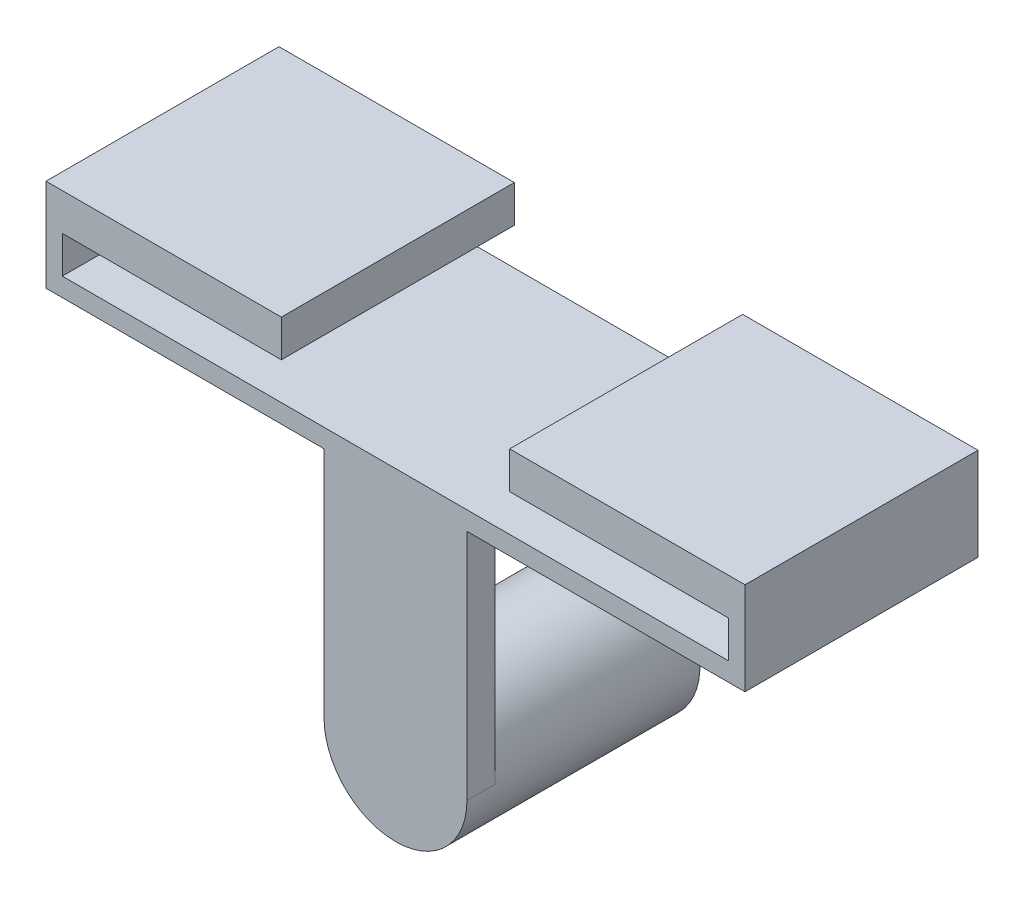
ISO-10303-21;
HEADER;
FILE_DESCRIPTION(('STEP AP214'),'2;1');
FILE_NAME('part.step','',(''),(''),'','','');
FILE_SCHEMA(('AUTOMOTIVE_DESIGN { 1 0 10303 214 1 1 1 1 }'));
ENDSEC;
DATA;
#1=APPLICATION_CONTEXT('core data for automotive mechanical design processes');
#2=APPLICATION_PROTOCOL_DEFINITION('international standard','automotive_design',2000,#1);
#3=PRODUCT_CONTEXT('',#1,'mechanical');
#4=PRODUCT('Part','Part','',(#3));
#5=PRODUCT_RELATED_PRODUCT_CATEGORY('part','',(#4));
#6=PRODUCT_DEFINITION_FORMATION('','',#4);
#7=PRODUCT_DEFINITION_CONTEXT('part definition',#1,'design');
#8=PRODUCT_DEFINITION('design','',#6,#7);
#9=PRODUCT_DEFINITION_SHAPE('','',#8);
#10=(LENGTH_UNIT() NAMED_UNIT(*) SI_UNIT(.MILLI.,.METRE.));
#11=(NAMED_UNIT(*) PLANE_ANGLE_UNIT() SI_UNIT($,.RADIAN.));
#12=(NAMED_UNIT(*) SI_UNIT($,.STERADIAN.) SOLID_ANGLE_UNIT());
#13=UNCERTAINTY_MEASURE_WITH_UNIT(LENGTH_MEASURE(1.E-05),#10,'distance_accuracy_value','');
#14=(GEOMETRIC_REPRESENTATION_CONTEXT(3) GLOBAL_UNCERTAINTY_ASSIGNED_CONTEXT((#13)) GLOBAL_UNIT_ASSIGNED_CONTEXT((#10,
#11,#12)) REPRESENTATION_CONTEXT('',''));
#15=CARTESIAN_POINT('',(0.,0.,0.));
#16=DIRECTION('',(0.,0.,1.));
#17=DIRECTION('',(1.,0.,0.));
#18=AXIS2_PLACEMENT_3D('',#15,#16,#17);
#19=CARTESIAN_POINT('',(12.4424225352113,10.1092,-25.4));
#20=DIRECTION('',(0.,-1.,0.));
#21=DIRECTION('',(1.,0.,0.));
#22=AXIS2_PLACEMENT_3D('',#19,#20,#21);
#23=PLANE('',#22);
#24=DIRECTION('',(1.,0.,0.));
#25=VECTOR('',#24,1.);
#26=CARTESIAN_POINT('',(12.4424225352113,10.1092,0.));
#27=LINE('',#26,#25);
#28=CARTESIAN_POINT('',(12.4424225352113,10.1092,0.));
#29=VERTEX_POINT('',#28);
#30=CARTESIAN_POINT('',(38.1,10.1092,0.));
#31=VERTEX_POINT('',#30);
#32=EDGE_CURVE('E177',#29,#31,#27,.T.);
#33=ORIENTED_EDGE('',*,*,#32,.T.);
#34=DIRECTION('',(0.,0.,1.));
#35=VECTOR('',#34,1.);
#36=CARTESIAN_POINT('',(38.1,10.1092,-25.4));
#37=LINE('',#36,#35);
#38=CARTESIAN_POINT('',(38.1,10.1092,-25.4));
#39=VERTEX_POINT('',#38);
#40=EDGE_CURVE('E52',#39,#31,#37,.T.);
#41=ORIENTED_EDGE('',*,*,#40,.F.);
#42=DIRECTION('',(1.,0.,0.));
#43=VECTOR('',#42,1.);
#44=CARTESIAN_POINT('',(12.4424225352113,10.1092,-25.4));
#45=LINE('',#44,#43);
#46=CARTESIAN_POINT('',(12.4424225352113,10.1092,-25.4));
#47=VERTEX_POINT('',#46);
#48=EDGE_CURVE('E119',#47,#39,#45,.T.);
#49=ORIENTED_EDGE('',*,*,#48,.F.);
#50=DIRECTION('',(0.,0.,1.));
#51=VECTOR('',#50,1.);
#52=CARTESIAN_POINT('',(12.4424225352113,10.1092,-25.4));
#53=LINE('',#52,#51);
#54=EDGE_CURVE('E68',#47,#29,#53,.T.);
#55=ORIENTED_EDGE('',*,*,#54,.T.);
#56=EDGE_LOOP('',(#33,#41,#49,#55));
#57=FACE_BOUND('',#56,.T.);
#58=ADVANCED_FACE('F45',(#57),#23,.F.);
#59=CARTESIAN_POINT('',(38.1,0.,-25.4));
#60=DIRECTION('',(1.,0.,0.));
#61=DIRECTION('',(0.,0.,-1.));
#62=AXIS2_PLACEMENT_3D('',#59,#60,#61);
#63=PLANE('',#62);
#64=DIRECTION('',(0.,1.,0.));
#65=VECTOR('',#64,1.);
#66=CARTESIAN_POINT('',(38.1,0.,0.));
#67=LINE('',#66,#65);
#68=CARTESIAN_POINT('',(38.1,0.,0.));
#69=VERTEX_POINT('',#68);
#70=EDGE_CURVE('E179',#69,#31,#67,.T.);
#71=ORIENTED_EDGE('',*,*,#70,.F.);
#72=DIRECTION('',(0.,0.,1.));
#73=VECTOR('',#72,1.);
#74=CARTESIAN_POINT('',(38.1,0.,-25.4));
#75=LINE('',#74,#73);
#76=CARTESIAN_POINT('',(38.1,0.,-25.4));
#77=VERTEX_POINT('',#76);
#78=EDGE_CURVE('E226',#77,#69,#75,.T.);
#79=ORIENTED_EDGE('',*,*,#78,.F.);
#80=DIRECTION('',(0.,1.,0.));
#81=VECTOR('',#80,1.);
#82=CARTESIAN_POINT('',(38.1,0.,-25.4));
#83=LINE('',#82,#81);
#84=EDGE_CURVE('E232',#77,#39,#83,.T.);
#85=ORIENTED_EDGE('',*,*,#84,.T.);
#86=ORIENTED_EDGE('',*,*,#40,.T.);
#87=EDGE_LOOP('',(#71,#79,#85,#86));
#88=FACE_BOUND('',#87,.T.);
#89=ADVANCED_FACE('F231',(#88),#63,.T.);
#90=CARTESIAN_POINT('',(-38.1,0.,-25.4));
#91=DIRECTION('',(0.,-1.,0.));
#92=DIRECTION('',(0.,0.,-1.));
#93=AXIS2_PLACEMENT_3D('',#90,#91,#92);
#94=PLANE('',#93);
#95=DIRECTION('',(0.,0.,1.));
#96=VECTOR('',#95,1.);
#97=CARTESIAN_POINT('',(7.79061514853763,0.,-3.048));
#98=LINE('',#97,#96);
#99=CARTESIAN_POINT('',(7.79061514853763,0.,-3.048));
#100=VERTEX_POINT('',#99);
#101=CARTESIAN_POINT('',(7.79061514853763,0.,0.));
#102=VERTEX_POINT('',#101);
#103=EDGE_CURVE('E420',#100,#102,#98,.T.);
#104=ORIENTED_EDGE('',*,*,#103,.F.);
#105=DIRECTION('',(1.,0.,0.));
#106=VECTOR('',#105,1.);
#107=CARTESIAN_POINT('',(0.,0.,-3.048));
#108=LINE('',#107,#106);
#109=CARTESIAN_POINT('',(-7.79061514853763,0.,-3.048));
#110=VERTEX_POINT('',#109);
#111=EDGE_CURVE('E414',#110,#100,#108,.T.);
#112=ORIENTED_EDGE('',*,*,#111,.F.);
#113=DIRECTION('',(0.,0.,1.));
#114=VECTOR('',#113,1.);
#115=CARTESIAN_POINT('',(-7.79061514853763,0.,-3.048));
#116=LINE('',#115,#114);
#117=CARTESIAN_POINT('',(-7.79061514853763,0.,0.));
#118=VERTEX_POINT('',#117);
#119=EDGE_CURVE('E180',#110,#118,#116,.T.);
#120=ORIENTED_EDGE('',*,*,#119,.T.);
#121=DIRECTION('',(1.,0.,0.));
#122=VECTOR('',#121,1.);
#123=CARTESIAN_POINT('',(-38.1,0.,0.));
#124=LINE('',#123,#122);
#125=CARTESIAN_POINT('',(-38.1,0.,0.));
#126=VERTEX_POINT('',#125);
#127=EDGE_CURVE('E184',#126,#118,#124,.T.);
#128=ORIENTED_EDGE('',*,*,#127,.F.);
#129=DIRECTION('',(0.,0.,1.));
#130=VECTOR('',#129,1.);
#131=CARTESIAN_POINT('',(-38.1,0.,-25.4));
#132=LINE('',#131,#130);
#133=CARTESIAN_POINT('',(-38.1,0.,-25.4));
#134=VERTEX_POINT('',#133);
#135=EDGE_CURVE('E224',#134,#126,#132,.T.);
#136=ORIENTED_EDGE('',*,*,#135,.F.);
#137=DIRECTION('',(1.,0.,0.));
#138=VECTOR('',#137,1.);
#139=CARTESIAN_POINT('',(-38.1,0.,-25.4));
#140=LINE('',#139,#138);
#141=EDGE_CURVE('E245',#134,#77,#140,.T.);
#142=ORIENTED_EDGE('',*,*,#141,.T.);
#143=ORIENTED_EDGE('',*,*,#78,.T.);
#144=EDGE_CURVE('E183',#102,#69,#124,.T.);
#145=ORIENTED_EDGE('',*,*,#144,.F.);
#146=EDGE_LOOP('',(#104,#112,#120,#128,#136,#142,#143,#145));
#147=FACE_BOUND('',#146,.T.);
#148=ADVANCED_FACE('F243',(#147),#94,.T.);
#149=CARTESIAN_POINT('',(-38.1,0.,-25.4));
#150=DIRECTION('',(1.,0.,0.));
#151=DIRECTION('',(0.,0.,-1.));
#152=AXIS2_PLACEMENT_3D('',#149,#150,#151);
#153=PLANE('',#152);
#154=DIRECTION('',(0.,1.,0.));
#155=VECTOR('',#154,1.);
#156=CARTESIAN_POINT('',(-38.1,0.,0.));
#157=LINE('',#156,#155);
#158=CARTESIAN_POINT('',(-38.1,10.1092,0.));
#159=VERTEX_POINT('',#158);
#160=EDGE_CURVE('E187',#126,#159,#157,.T.);
#161=ORIENTED_EDGE('',*,*,#160,.T.);
#162=DIRECTION('',(0.,0.,1.));
#163=VECTOR('',#162,1.);
#164=CARTESIAN_POINT('',(-38.1,10.1092,-25.4));
#165=LINE('',#164,#163);
#166=CARTESIAN_POINT('',(-38.1,10.1092,-25.4));
#167=VERTEX_POINT('',#166);
#168=EDGE_CURVE('E221',#167,#159,#165,.T.);
#169=ORIENTED_EDGE('',*,*,#168,.F.);
#170=DIRECTION('',(0.,1.,0.));
#171=VECTOR('',#170,1.);
#172=CARTESIAN_POINT('',(-38.1,0.,-25.4));
#173=LINE('',#172,#171);
#174=EDGE_CURVE('E247',#134,#167,#173,.T.);
#175=ORIENTED_EDGE('',*,*,#174,.F.);
#176=ORIENTED_EDGE('',*,*,#135,.T.);
#177=EDGE_LOOP('',(#161,#169,#175,#176));
#178=FACE_BOUND('',#177,.T.);
#179=ADVANCED_FACE('F284',(#178),#153,.F.);
#180=CARTESIAN_POINT('',(-38.1,10.1092,-25.4));
#181=DIRECTION('',(0.,-1.,0.));
#182=DIRECTION('',(0.,0.,-1.));
#183=AXIS2_PLACEMENT_3D('',#180,#181,#182);
#184=PLANE('',#183);
#185=DIRECTION('',(1.,0.,0.));
#186=VECTOR('',#185,1.);
#187=CARTESIAN_POINT('',(-38.1,10.1092,0.));
#188=LINE('',#187,#186);
#189=CARTESIAN_POINT('',(-12.4424225352113,10.1092,0.));
#190=VERTEX_POINT('',#189);
#191=EDGE_CURVE('E189',#159,#190,#188,.T.);
#192=ORIENTED_EDGE('',*,*,#191,.T.);
#193=DIRECTION('',(0.,0.,1.));
#194=VECTOR('',#193,1.);
#195=CARTESIAN_POINT('',(-12.4424225352113,10.1092,-25.4));
#196=LINE('',#195,#194);
#197=CARTESIAN_POINT('',(-12.4424225352113,10.1092,-25.4));
#198=VERTEX_POINT('',#197);
#199=EDGE_CURVE('E218',#198,#190,#196,.T.);
#200=ORIENTED_EDGE('',*,*,#199,.F.);
#201=DIRECTION('',(1.,0.,0.));
#202=VECTOR('',#201,1.);
#203=CARTESIAN_POINT('',(-38.1,10.1092,-25.4));
#204=LINE('',#203,#202);
#205=EDGE_CURVE('E253',#167,#198,#204,.T.);
#206=ORIENTED_EDGE('',*,*,#205,.F.);
#207=ORIENTED_EDGE('',*,*,#168,.T.);
#208=EDGE_LOOP('',(#192,#200,#206,#207));
#209=FACE_BOUND('',#208,.T.);
#210=ADVANCED_FACE('F288',(#209),#184,.F.);
#211=CARTESIAN_POINT('',(-12.4424225352113,10.1092,-25.4));
#212=DIRECTION('',(-1.,0.,0.));
#213=DIRECTION('',(0.,-1.,0.));
#214=AXIS2_PLACEMENT_3D('',#211,#212,#213);
#215=PLANE('',#214);
#216=DIRECTION('',(0.,-1.,0.));
#217=VECTOR('',#216,1.);
#218=CARTESIAN_POINT('',(-12.4424225352113,10.1092,0.));
#219=LINE('',#218,#217);
#220=CARTESIAN_POINT('',(-12.4424225352113,6.0706,0.));
#221=VERTEX_POINT('',#220);
#222=EDGE_CURVE('E191',#190,#221,#219,.T.);
#223=ORIENTED_EDGE('',*,*,#222,.T.);
#224=DIRECTION('',(0.,0.,1.));
#225=VECTOR('',#224,1.);
#226=CARTESIAN_POINT('',(-12.4424225352113,6.0706,-25.4));
#227=LINE('',#226,#225);
#228=CARTESIAN_POINT('',(-12.4424225352113,6.0706,-25.4));
#229=VERTEX_POINT('',#228);
#230=EDGE_CURVE('E216',#229,#221,#227,.T.);
#231=ORIENTED_EDGE('',*,*,#230,.F.);
#232=DIRECTION('',(0.,-1.,0.));
#233=VECTOR('',#232,1.);
#234=CARTESIAN_POINT('',(-12.4424225352113,10.1092,-25.4));
#235=LINE('',#234,#233);
#236=EDGE_CURVE('E255',#198,#229,#235,.T.);
#237=ORIENTED_EDGE('',*,*,#236,.F.);
#238=ORIENTED_EDGE('',*,*,#199,.T.);
#239=EDGE_LOOP('',(#223,#231,#237,#238));
#240=FACE_BOUND('',#239,.T.);
#241=ADVANCED_FACE('F292',(#240),#215,.F.);
#242=CARTESIAN_POINT('',(-36.322,6.0706,-25.4));
#243=DIRECTION('',(0.,-1.,0.));
#244=DIRECTION('',(0.,0.,-1.));
#245=AXIS2_PLACEMENT_3D('',#242,#243,#244);
#246=PLANE('',#245);
#247=DIRECTION('',(1.,0.,0.));
#248=VECTOR('',#247,1.);
#249=CARTESIAN_POINT('',(-36.322,6.0706,0.));
#250=LINE('',#249,#248);
#251=CARTESIAN_POINT('',(-36.322,6.0706,0.));
#252=VERTEX_POINT('',#251);
#253=EDGE_CURVE('E194',#252,#221,#250,.T.);
#254=ORIENTED_EDGE('',*,*,#253,.F.);
#255=DIRECTION('',(0.,0.,1.));
#256=VECTOR('',#255,1.);
#257=CARTESIAN_POINT('',(-36.322,6.0706,-25.4));
#258=LINE('',#257,#256);
#259=CARTESIAN_POINT('',(-36.322,6.0706,-25.4));
#260=VERTEX_POINT('',#259);
#261=EDGE_CURVE('E214',#260,#252,#258,.T.);
#262=ORIENTED_EDGE('',*,*,#261,.F.);
#263=DIRECTION('',(1.,0.,0.));
#264=VECTOR('',#263,1.);
#265=CARTESIAN_POINT('',(-36.322,6.0706,-25.4));
#266=LINE('',#265,#264);
#267=EDGE_CURVE('E257',#260,#229,#266,.T.);
#268=ORIENTED_EDGE('',*,*,#267,.T.);
#269=ORIENTED_EDGE('',*,*,#230,.T.);
#270=EDGE_LOOP('',(#254,#262,#268,#269));
#271=FACE_BOUND('',#270,.T.);
#272=ADVANCED_FACE('F296',(#271),#246,.T.);
#273=CARTESIAN_POINT('',(-36.322,6.0706,-25.4));
#274=DIRECTION('',(-1.,0.,0.));
#275=DIRECTION('',(0.,-1.,0.));
#276=AXIS2_PLACEMENT_3D('',#273,#274,#275);
#277=PLANE('',#276);
#278=DIRECTION('',(0.,-1.,0.));
#279=VECTOR('',#278,1.);
#280=CARTESIAN_POINT('',(-36.322,6.0706,0.));
#281=LINE('',#280,#279);
#282=CARTESIAN_POINT('',(-36.322,2.032,0.));
#283=VERTEX_POINT('',#282);
#284=EDGE_CURVE('E197',#252,#283,#281,.T.);
#285=ORIENTED_EDGE('',*,*,#284,.T.);
#286=DIRECTION('',(0.,0.,1.));
#287=VECTOR('',#286,1.);
#288=CARTESIAN_POINT('',(-36.322,2.032,-25.4));
#289=LINE('',#288,#287);
#290=CARTESIAN_POINT('',(-36.322,2.032,-25.4));
#291=VERTEX_POINT('',#290);
#292=EDGE_CURVE('E212',#291,#283,#289,.T.);
#293=ORIENTED_EDGE('',*,*,#292,.F.);
#294=DIRECTION('',(0.,-1.,0.));
#295=VECTOR('',#294,1.);
#296=CARTESIAN_POINT('',(-36.322,6.0706,-25.4));
#297=LINE('',#296,#295);
#298=EDGE_CURVE('E260',#260,#291,#297,.T.);
#299=ORIENTED_EDGE('',*,*,#298,.F.);
#300=ORIENTED_EDGE('',*,*,#261,.T.);
#301=EDGE_LOOP('',(#285,#293,#299,#300));
#302=FACE_BOUND('',#301,.T.);
#303=ADVANCED_FACE('F300',(#302),#277,.F.);
#304=CARTESIAN_POINT('',(36.322,2.032,-25.4));
#305=DIRECTION('',(0.,1.,0.));
#306=DIRECTION('',(-1.,0.,0.));
#307=AXIS2_PLACEMENT_3D('',#304,#305,#306);
#308=PLANE('',#307);
#309=DIRECTION('',(-1.,0.,0.));
#310=VECTOR('',#309,1.);
#311=CARTESIAN_POINT('',(36.322,2.032,0.));
#312=LINE('',#311,#310);
#313=CARTESIAN_POINT('',(36.322,2.032,0.));
#314=VERTEX_POINT('',#313);
#315=EDGE_CURVE('E200',#314,#283,#312,.T.);
#316=ORIENTED_EDGE('',*,*,#315,.F.);
#317=DIRECTION('',(0.,0.,1.));
#318=VECTOR('',#317,1.);
#319=CARTESIAN_POINT('',(36.322,2.032,-25.4));
#320=LINE('',#319,#318);
#321=CARTESIAN_POINT('',(36.322,2.032,-25.4));
#322=VERTEX_POINT('',#321);
#323=EDGE_CURVE('E161',#322,#314,#320,.T.);
#324=ORIENTED_EDGE('',*,*,#323,.F.);
#325=DIRECTION('',(-1.,0.,0.));
#326=VECTOR('',#325,1.);
#327=CARTESIAN_POINT('',(36.322,2.032,-25.4));
#328=LINE('',#327,#326);
#329=EDGE_CURVE('E169',#322,#291,#328,.T.);
#330=ORIENTED_EDGE('',*,*,#329,.T.);
#331=ORIENTED_EDGE('',*,*,#292,.T.);
#332=EDGE_LOOP('',(#316,#324,#330,#331));
#333=FACE_BOUND('',#332,.T.);
#334=ADVANCED_FACE('F263',(#333),#308,.T.);
#335=CARTESIAN_POINT('',(36.322,6.0706,-25.4));
#336=DIRECTION('',(-1.,0.,0.));
#337=DIRECTION('',(0.,-1.,0.));
#338=AXIS2_PLACEMENT_3D('',#335,#336,#337);
#339=PLANE('',#338);
#340=DIRECTION('',(0.,-1.,0.));
#341=VECTOR('',#340,1.);
#342=CARTESIAN_POINT('',(36.322,6.0706,0.));
#343=LINE('',#342,#341);
#344=CARTESIAN_POINT('',(36.322,6.0706,0.));
#345=VERTEX_POINT('',#344);
#346=EDGE_CURVE('E156',#345,#314,#343,.T.);
#347=ORIENTED_EDGE('',*,*,#346,.F.);
#348=DIRECTION('',(0.,0.,1.));
#349=VECTOR('',#348,1.);
#350=CARTESIAN_POINT('',(36.322,6.0706,-25.4));
#351=LINE('',#350,#349);
#352=CARTESIAN_POINT('',(36.322,6.0706,-25.4));
#353=VERTEX_POINT('',#352);
#354=EDGE_CURVE('E151',#353,#345,#351,.T.);
#355=ORIENTED_EDGE('',*,*,#354,.F.);
#356=DIRECTION('',(0.,-1.,0.));
#357=VECTOR('',#356,1.);
#358=CARTESIAN_POINT('',(36.322,6.0706,-25.4));
#359=LINE('',#358,#357);
#360=EDGE_CURVE('E154',#353,#322,#359,.T.);
#361=ORIENTED_EDGE('',*,*,#360,.T.);
#362=ORIENTED_EDGE('',*,*,#323,.T.);
#363=EDGE_LOOP('',(#347,#355,#361,#362));
#364=FACE_BOUND('',#363,.T.);
#365=ADVANCED_FACE('F153',(#364),#339,.T.);
#366=CARTESIAN_POINT('',(12.4424225352113,6.0706,-25.4));
#367=DIRECTION('',(0.,-1.,0.));
#368=DIRECTION('',(1.,0.,0.));
#369=AXIS2_PLACEMENT_3D('',#366,#367,#368);
#370=PLANE('',#369);
#371=DIRECTION('',(1.,0.,0.));
#372=VECTOR('',#371,1.);
#373=CARTESIAN_POINT('',(12.4424225352113,6.0706,0.));
#374=LINE('',#373,#372);
#375=CARTESIAN_POINT('',(12.4424225352113,6.0706,0.));
#376=VERTEX_POINT('',#375);
#377=EDGE_CURVE('E204',#376,#345,#374,.T.);
#378=ORIENTED_EDGE('',*,*,#377,.F.);
#379=DIRECTION('',(0.,0.,1.));
#380=VECTOR('',#379,1.);
#381=CARTESIAN_POINT('',(12.4424225352113,6.0706,-25.4));
#382=LINE('',#381,#380);
#383=CARTESIAN_POINT('',(12.4424225352113,6.0706,-25.4));
#384=VERTEX_POINT('',#383);
#385=EDGE_CURVE('E162',#384,#376,#382,.T.);
#386=ORIENTED_EDGE('',*,*,#385,.F.);
#387=DIRECTION('',(1.,0.,0.));
#388=VECTOR('',#387,1.);
#389=CARTESIAN_POINT('',(12.4424225352113,6.0706,-25.4));
#390=LINE('',#389,#388);
#391=EDGE_CURVE('E167',#384,#353,#390,.T.);
#392=ORIENTED_EDGE('',*,*,#391,.T.);
#393=ORIENTED_EDGE('',*,*,#354,.T.);
#394=EDGE_LOOP('',(#378,#386,#392,#393));
#395=FACE_BOUND('',#394,.T.);
#396=ADVANCED_FACE('F171',(#395),#370,.T.);
#397=CARTESIAN_POINT('',(12.4424225352113,10.1092,-25.4));
#398=DIRECTION('',(-1.,0.,0.));
#399=DIRECTION('',(0.,-1.,0.));
#400=AXIS2_PLACEMENT_3D('',#397,#398,#399);
#401=PLANE('',#400);
#402=DIRECTION('',(0.,-1.,0.));
#403=VECTOR('',#402,1.);
#404=CARTESIAN_POINT('',(12.4424225352113,10.1092,0.));
#405=LINE('',#404,#403);
#406=EDGE_CURVE('E206',#29,#376,#405,.T.);
#407=ORIENTED_EDGE('',*,*,#406,.F.);
#408=ORIENTED_EDGE('',*,*,#54,.F.);
#409=DIRECTION('',(0.,-1.,0.));
#410=VECTOR('',#409,1.);
#411=CARTESIAN_POINT('',(12.4424225352113,10.1092,-25.4));
#412=LINE('',#411,#410);
#413=EDGE_CURVE('E172',#47,#384,#412,.T.);
#414=ORIENTED_EDGE('',*,*,#413,.T.);
#415=ORIENTED_EDGE('',*,*,#385,.T.);
#416=EDGE_LOOP('',(#407,#408,#414,#415));
#417=FACE_BOUND('',#416,.T.);
#418=ADVANCED_FACE('F266',(#417),#401,.T.);
#419=CARTESIAN_POINT('',(0.,0.,-25.4));
#420=DIRECTION('',(0.,0.,1.));
#421=DIRECTION('',(1.,0.,0.));
#422=AXIS2_PLACEMENT_3D('',#419,#420,#421);
#423=PLANE('',#422);
#424=ORIENTED_EDGE('',*,*,#48,.T.);
#425=ORIENTED_EDGE('',*,*,#84,.F.);
#426=ORIENTED_EDGE('',*,*,#141,.F.);
#427=ORIENTED_EDGE('',*,*,#174,.T.);
#428=ORIENTED_EDGE('',*,*,#205,.T.);
#429=ORIENTED_EDGE('',*,*,#236,.T.);
#430=ORIENTED_EDGE('',*,*,#267,.F.);
#431=ORIENTED_EDGE('',*,*,#298,.T.);
#432=ORIENTED_EDGE('',*,*,#329,.F.);
#433=ORIENTED_EDGE('',*,*,#360,.F.);
#434=ORIENTED_EDGE('',*,*,#391,.F.);
#435=ORIENTED_EDGE('',*,*,#413,.F.);
#436=EDGE_LOOP('',(#424,#425,#426,#427,#428,#429,#430,#431,#432,#433,#434,#435));
#437=FACE_BOUND('',#436,.T.);
#438=ADVANCED_FACE('F166',(#437),#423,.F.);
#439=CARTESIAN_POINT('',(0.,0.,0.));
#440=DIRECTION('',(0.,0.,1.));
#441=DIRECTION('',(1.,0.,0.));
#442=AXIS2_PLACEMENT_3D('',#439,#440,#441);
#443=PLANE('',#442);
#444=DIRECTION('',(0.,-1.,0.));
#445=VECTOR('',#444,1.);
#446=CARTESIAN_POINT('',(-7.79061514853763,0.,0.));
#447=LINE('',#446,#445);
#448=CARTESIAN_POINT('',(-7.79061514853762,-25.4,0.));
#449=VERTEX_POINT('',#448);
#450=EDGE_CURVE('E59',#118,#449,#447,.T.);
#451=ORIENTED_EDGE('',*,*,#450,.T.);
#452=CARTESIAN_POINT('',(0.,-25.4,0.));
#453=DIRECTION('',(0.,0.,-1.));
#454=DIRECTION('',(-1.,0.,0.));
#455=AXIS2_PLACEMENT_3D('',#452,#453,#454);
#456=CIRCLE('',#455,7.79061514853763);
#457=CARTESIAN_POINT('',(7.79061514853763,-25.4,0.));
#458=VERTEX_POINT('',#457);
#459=EDGE_CURVE('E402',#458,#449,#456,.T.);
#460=ORIENTED_EDGE('',*,*,#459,.F.);
#461=DIRECTION('',(0.,-1.,0.));
#462=VECTOR('',#461,1.);
#463=CARTESIAN_POINT('',(7.79061514853763,0.,0.));
#464=LINE('',#463,#462);
#465=EDGE_CURVE('E239',#102,#458,#464,.T.);
#466=ORIENTED_EDGE('',*,*,#465,.F.);
#467=ORIENTED_EDGE('',*,*,#144,.T.);
#468=ORIENTED_EDGE('',*,*,#70,.T.);
#469=ORIENTED_EDGE('',*,*,#32,.F.);
#470=ORIENTED_EDGE('',*,*,#406,.T.);
#471=ORIENTED_EDGE('',*,*,#377,.T.);
#472=ORIENTED_EDGE('',*,*,#346,.T.);
#473=ORIENTED_EDGE('',*,*,#315,.T.);
#474=ORIENTED_EDGE('',*,*,#284,.F.);
#475=ORIENTED_EDGE('',*,*,#253,.T.);
#476=ORIENTED_EDGE('',*,*,#222,.F.);
#477=ORIENTED_EDGE('',*,*,#191,.F.);
#478=ORIENTED_EDGE('',*,*,#160,.F.);
#479=ORIENTED_EDGE('',*,*,#127,.T.);
#480=EDGE_LOOP('',(#451,#460,#466,#467,#468,#469,#470,#471,#472,#473,#474,#475,#476,#477,#478,#479));
#481=FACE_BOUND('',#480,.T.);
#482=ADVANCED_FACE('F234',(#481),#443,.T.);
#483=CARTESIAN_POINT('',(-7.79061514853763,0.,-3.048));
#484=DIRECTION('',(-1.,0.,0.));
#485=DIRECTION('',(0.,-1.,0.));
#486=AXIS2_PLACEMENT_3D('',#483,#484,#485);
#487=PLANE('',#486);
#488=ORIENTED_EDGE('',*,*,#450,.F.);
#489=ORIENTED_EDGE('',*,*,#119,.F.);
#490=DIRECTION('',(0.,-1.,0.));
#491=VECTOR('',#490,1.);
#492=CARTESIAN_POINT('',(-7.79061514853763,0.,-3.048));
#493=LINE('',#492,#491);
#494=CARTESIAN_POINT('',(-7.79061514853762,-25.4,-3.048));
#495=VERTEX_POINT('',#494);
#496=EDGE_CURVE('E408',#110,#495,#493,.T.);
#497=ORIENTED_EDGE('',*,*,#496,.T.);
#498=DIRECTION('',(0.,0.,1.));
#499=VECTOR('',#498,1.);
#500=CARTESIAN_POINT('',(-7.79061514853762,-25.4,-3.048));
#501=LINE('',#500,#499);
#502=EDGE_CURVE('E416',#495,#449,#501,.T.);
#503=ORIENTED_EDGE('',*,*,#502,.T.);
#504=EDGE_LOOP('',(#488,#489,#497,#503));
#505=FACE_BOUND('',#504,.T.);
#506=ADVANCED_FACE('F337',(#505),#487,.T.);
#507=CARTESIAN_POINT('',(7.79061514853763,0.,-3.048));
#508=DIRECTION('',(-1.,0.,0.));
#509=DIRECTION('',(0.,-1.,0.));
#510=AXIS2_PLACEMENT_3D('',#507,#508,#509);
#511=PLANE('',#510);
#512=ORIENTED_EDGE('',*,*,#465,.T.);
#513=DIRECTION('',(0.,0.,1.));
#514=VECTOR('',#513,1.);
#515=CARTESIAN_POINT('',(7.79061514853763,-25.4,-3.048));
#516=LINE('',#515,#514);
#517=CARTESIAN_POINT('',(7.79061514853763,-25.4,-3.048));
#518=VERTEX_POINT('',#517);
#519=EDGE_CURVE('E423',#518,#458,#516,.T.);
#520=ORIENTED_EDGE('',*,*,#519,.F.);
#521=DIRECTION('',(0.,-1.,0.));
#522=VECTOR('',#521,1.);
#523=CARTESIAN_POINT('',(7.79061514853763,0.,-3.048));
#524=LINE('',#523,#522);
#525=EDGE_CURVE('E411',#100,#518,#524,.T.);
#526=ORIENTED_EDGE('',*,*,#525,.F.);
#527=ORIENTED_EDGE('',*,*,#103,.T.);
#528=EDGE_LOOP('',(#512,#520,#526,#527));
#529=FACE_BOUND('',#528,.T.);
#530=ADVANCED_FACE('F355',(#529),#511,.F.);
#531=CARTESIAN_POINT('',(0.,0.,-3.048));
#532=DIRECTION('',(0.,0.,1.));
#533=DIRECTION('',(1.,0.,0.));
#534=AXIS2_PLACEMENT_3D('',#531,#532,#533);
#535=PLANE('',#534);
#536=CARTESIAN_POINT('',(0.,-25.4,-3.048));
#537=DIRECTION('',(0.,0.,1.));
#538=DIRECTION('',(1.,0.,0.));
#539=AXIS2_PLACEMENT_3D('',#536,#537,#538);
#540=CIRCLE('',#539,7.79061514853763);
#541=EDGE_CURVE('E11',#495,#518,#540,.F.);
#542=ORIENTED_EDGE('',*,*,#541,.F.);
#543=ORIENTED_EDGE('',*,*,#496,.F.);
#544=ORIENTED_EDGE('',*,*,#111,.T.);
#545=ORIENTED_EDGE('',*,*,#525,.T.);
#546=EDGE_LOOP('',(#542,#543,#544,#545));
#547=FACE_BOUND('',#546,.T.);
#548=ADVANCED_FACE('F364',(#547),#535,.F.);
#549=CARTESIAN_POINT('',(0.,-25.4,-25.4));
#550=DIRECTION('',(0.,0.,1.));
#551=DIRECTION('',(1.,0.,0.));
#552=AXIS2_PLACEMENT_3D('',#549,#550,#551);
#553=CYLINDRICAL_SURFACE('',#552,7.79061514853763);
#554=ORIENTED_EDGE('',*,*,#519,.T.);
#555=ORIENTED_EDGE('',*,*,#459,.T.);
#556=ORIENTED_EDGE('',*,*,#502,.F.);
#557=ORIENTED_EDGE('',*,*,#541,.T.);
#558=EDGE_LOOP('',(#554,#555,#556,#557));
#559=FACE_BOUND('',#558,.T.);
#560=CARTESIAN_POINT('',(0.,-25.4,-25.4));
#561=DIRECTION('',(0.,0.,-1.));
#562=DIRECTION('',(-1.,0.,0.));
#563=AXIS2_PLACEMENT_3D('',#560,#561,#562);
#564=CIRCLE('',#563,7.79061514853763);
#565=CARTESIAN_POINT('',(-7.79061514853763,-25.4,-25.4));
#566=VERTEX_POINT('',#565);
#567=EDGE_CURVE('E400',#566,#566,#564,.T.);
#568=ORIENTED_EDGE('',*,*,#567,.F.);
#569=EDGE_LOOP('',(#568));
#570=FACE_BOUND('',#569,.T.);
#571=ADVANCED_FACE('F373',(#559,#570),#553,.T.);
#572=CARTESIAN_POINT('',(0.,-25.4,-25.4));
#573=DIRECTION('',(0.,0.,-1.));
#574=DIRECTION('',(-1.,0.,0.));
#575=AXIS2_PLACEMENT_3D('',#572,#573,#574);
#576=PLANE('',#575);
#577=ORIENTED_EDGE('',*,*,#567,.T.);
#578=EDGE_LOOP('',(#577));
#579=FACE_BOUND('',#578,.T.);
#580=ADVANCED_FACE('F384',(#579),#576,.T.);
#581=CLOSED_SHELL('',(#58,#89,#148,#179,#210,#241,#272,#303,#334,#365,#396,#418,#438,#482,#506,
#530,#548,#571,#580));
#582=MANIFOLD_SOLID_BREP('B2',#581);
#583=ADVANCED_BREP_SHAPE_REPRESENTATION('',(#18,#582),#14);
#584=SHAPE_DEFINITION_REPRESENTATION(#9,#583);
ENDSEC;
END-ISO-10303-21;
